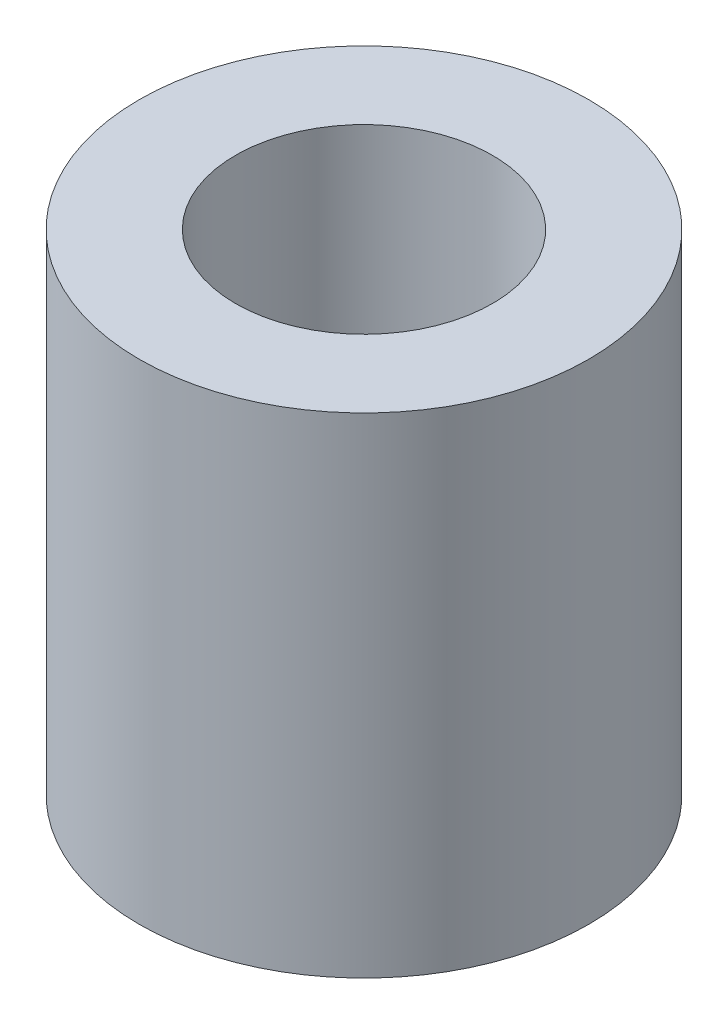
ISO-10303-21;
HEADER;
FILE_DESCRIPTION(('STEP AP214'),'2;1');
FILE_NAME('part.step','',(''),(''),'','','');
FILE_SCHEMA(('AUTOMOTIVE_DESIGN { 1 0 10303 214 1 1 1 1 }'));
ENDSEC;
DATA;
#1=APPLICATION_CONTEXT('core data for automotive mechanical design processes');
#2=APPLICATION_PROTOCOL_DEFINITION('international standard','automotive_design',2000,#1);
#3=PRODUCT_CONTEXT('',#1,'mechanical');
#4=PRODUCT('Part','Part','',(#3));
#5=PRODUCT_RELATED_PRODUCT_CATEGORY('part','',(#4));
#6=PRODUCT_DEFINITION_FORMATION('','',#4);
#7=PRODUCT_DEFINITION_CONTEXT('part definition',#1,'design');
#8=PRODUCT_DEFINITION('design','',#6,#7);
#9=PRODUCT_DEFINITION_SHAPE('','',#8);
#10=(LENGTH_UNIT() NAMED_UNIT(*) SI_UNIT(.MILLI.,.METRE.));
#11=(NAMED_UNIT(*) PLANE_ANGLE_UNIT() SI_UNIT($,.RADIAN.));
#12=(NAMED_UNIT(*) SI_UNIT($,.STERADIAN.) SOLID_ANGLE_UNIT());
#13=UNCERTAINTY_MEASURE_WITH_UNIT(LENGTH_MEASURE(1.E-05),#10,'distance_accuracy_value','');
#14=(GEOMETRIC_REPRESENTATION_CONTEXT(3) GLOBAL_UNCERTAINTY_ASSIGNED_CONTEXT((#13)) GLOBAL_UNIT_ASSIGNED_CONTEXT((#10,
#11,#12)) REPRESENTATION_CONTEXT('',''));
#15=CARTESIAN_POINT('',(0.,0.,0.));
#16=DIRECTION('',(0.,0.,1.));
#17=DIRECTION('',(1.,0.,0.));
#18=AXIS2_PLACEMENT_3D('',#15,#16,#17);
#19=CARTESIAN_POINT('',(0.,-7.62,0.));
#20=DIRECTION('',(0.,1.,0.));
#21=DIRECTION('',(0.,0.,1.));
#22=AXIS2_PLACEMENT_3D('',#19,#20,#21);
#23=CYLINDRICAL_SURFACE('',#22,3.5);
#24=CARTESIAN_POINT('',(0.,-7.62,0.));
#25=DIRECTION('',(0.,1.,0.));
#26=DIRECTION('',(0.,0.,1.));
#27=AXIS2_PLACEMENT_3D('',#24,#25,#26);
#28=CIRCLE('',#27,3.5);
#29=CARTESIAN_POINT('',(0.,-7.62,3.5));
#30=VERTEX_POINT('',#29);
#31=EDGE_CURVE('E10',#30,#30,#28,.T.);
#32=CARTESIAN_POINT('',(0.,0.,0.));
#33=DIRECTION('',(0.,1.,0.));
#34=DIRECTION('',(0.,0.,1.));
#35=AXIS2_PLACEMENT_3D('',#32,#33,#34);
#36=CIRCLE('',#35,3.5);
#37=CARTESIAN_POINT('',(0.,0.,3.5));
#38=VERTEX_POINT('',#37);
#39=EDGE_CURVE('E37',#38,#38,#36,.T.);
#40=CARTESIAN_POINT('',(0.,-7.62,3.5));
#41=CARTESIAN_POINT('',(0.,-7.540625,3.5));
#42=CARTESIAN_POINT('',(0.,-7.46125,3.5));
#43=CARTESIAN_POINT('',(0.,-7.3025,3.5));
#44=CARTESIAN_POINT('',(0.,-7.223125,3.5));
#45=CARTESIAN_POINT('',(0.,-7.064375,3.5));
#46=CARTESIAN_POINT('',(0.,-6.985,3.5));
#47=CARTESIAN_POINT('',(0.,-6.82625,3.5));
#48=CARTESIAN_POINT('',(0.,-6.746875,3.5));
#49=CARTESIAN_POINT('',(0.,-6.588125,3.5));
#50=CARTESIAN_POINT('',(0.,-6.50875,3.5));
#51=CARTESIAN_POINT('',(0.,-6.35,3.5));
#52=CARTESIAN_POINT('',(0.,-6.270625,3.5));
#53=CARTESIAN_POINT('',(0.,-6.111875,3.5));
#54=CARTESIAN_POINT('',(0.,-6.0325,3.5));
#55=CARTESIAN_POINT('',(0.,-5.87375,3.5));
#56=CARTESIAN_POINT('',(0.,-5.794375,3.5));
#57=CARTESIAN_POINT('',(0.,-5.635625,3.5));
#58=CARTESIAN_POINT('',(0.,-5.55625,3.5));
#59=CARTESIAN_POINT('',(0.,-5.3975,3.5));
#60=CARTESIAN_POINT('',(0.,-5.318125,3.5));
#61=CARTESIAN_POINT('',(0.,-5.159375,3.5));
#62=CARTESIAN_POINT('',(0.,-5.08,3.5));
#63=CARTESIAN_POINT('',(0.,-4.92125,3.5));
#64=CARTESIAN_POINT('',(0.,-4.841875,3.5));
#65=CARTESIAN_POINT('',(0.,-4.683125,3.5));
#66=CARTESIAN_POINT('',(0.,-4.60375,3.5));
#67=CARTESIAN_POINT('',(0.,-4.445,3.5));
#68=CARTESIAN_POINT('',(0.,-4.365625,3.5));
#69=CARTESIAN_POINT('',(0.,-4.206875,3.5));
#70=CARTESIAN_POINT('',(0.,-4.1275,3.5));
#71=CARTESIAN_POINT('',(0.,-3.96875,3.5));
#72=CARTESIAN_POINT('',(0.,-3.889375,3.5));
#73=CARTESIAN_POINT('',(0.,-3.730625,3.5));
#74=CARTESIAN_POINT('',(0.,-3.65125,3.5));
#75=CARTESIAN_POINT('',(0.,-3.4925,3.5));
#76=CARTESIAN_POINT('',(0.,-3.413125,3.5));
#77=CARTESIAN_POINT('',(0.,-3.254375,3.5));
#78=CARTESIAN_POINT('',(0.,-3.175,3.5));
#79=CARTESIAN_POINT('',(0.,-3.01625,3.5));
#80=CARTESIAN_POINT('',(0.,-2.936875,3.5));
#81=CARTESIAN_POINT('',(0.,-2.778125,3.5));
#82=CARTESIAN_POINT('',(0.,-2.69875,3.5));
#83=CARTESIAN_POINT('',(0.,-2.54,3.5));
#84=CARTESIAN_POINT('',(0.,-2.460625,3.5));
#85=CARTESIAN_POINT('',(0.,-2.301875,3.5));
#86=CARTESIAN_POINT('',(0.,-2.2225,3.5));
#87=CARTESIAN_POINT('',(0.,-2.06375,3.5));
#88=CARTESIAN_POINT('',(0.,-1.984375,3.5));
#89=CARTESIAN_POINT('',(0.,-1.825625,3.5));
#90=CARTESIAN_POINT('',(0.,-1.74625,3.5));
#91=CARTESIAN_POINT('',(0.,-1.5875,3.5));
#92=CARTESIAN_POINT('',(0.,-1.508125,3.5));
#93=CARTESIAN_POINT('',(0.,-1.349375,3.5));
#94=CARTESIAN_POINT('',(0.,-1.27,3.5));
#95=CARTESIAN_POINT('',(0.,-1.11125,3.5));
#96=CARTESIAN_POINT('',(0.,-1.031875,3.5));
#97=CARTESIAN_POINT('',(0.,-0.873125,3.5));
#98=CARTESIAN_POINT('',(0.,-0.79375,3.5));
#99=CARTESIAN_POINT('',(0.,-0.635,3.5));
#100=CARTESIAN_POINT('',(0.,-0.555625,3.5));
#101=CARTESIAN_POINT('',(0.,-0.396875,3.5));
#102=CARTESIAN_POINT('',(0.,-0.3175,3.5));
#103=CARTESIAN_POINT('',(0.,-0.15875,3.5));
#104=CARTESIAN_POINT('',(0.,-0.0793749999999999,3.5));
#105=CARTESIAN_POINT('',(0.,0.,3.5));
#106=B_SPLINE_CURVE_WITH_KNOTS('',3,(#40,#41,#42,#43,#44,#45,#46,#47,#48,#49,#50,#51,#52,#53,
#54,#55,#56,#57,#58,#59,#60,#61,#62,#63,#64,#65,#66,#67,#68,#69,#70,#71,#72,#73,#74,#75,#76,#77,
#78,#79,#80,#81,#82,#83,#84,#85,#86,#87,#88,#89,#90,#91,#92,#93,#94,#95,#96,#97,#98,#99,#100,
#101,#102,#103,#104,#105),.UNSPECIFIED.,.F.,.F.,(4,2,2,2,2,2,2,2,2,2,2,2,2,2,2,2,2,2,2,2,2,2,2,
2,2,2,2,2,2,2,2,2,4),(0.,0.238125,0.476249999999999,0.714375,0.952499999999999,1.190625,1.42875,
1.666875,1.905,2.143125,2.38125,2.619375,2.8575,3.095625,3.33375,3.571875,3.81,4.048125,4.28625,
4.524375,4.7625,5.000625,5.23875,5.476875,5.715,5.953125,6.19125,6.429375,6.6675,6.905625,
7.14375,7.381875,7.62),.UNSPECIFIED.);
#107=EDGE_CURVE('BSEAM34',#30,#38,#106,.T.);
#108=ORIENTED_EDGE('',*,*,#31,.T.);
#109=ORIENTED_EDGE('',*,*,#39,.F.);
#110=ORIENTED_EDGE('',*,*,#107,.T.);
#111=ORIENTED_EDGE('',*,*,#107,.F.);
#112=EDGE_LOOP('',(#108,#110,#109,#111));
#113=FACE_BOUND('',#112,.T.);
#114=ADVANCED_FACE('F34',(#113),#23,.T.);
#115=CARTESIAN_POINT('',(0.,-7.62,0.));
#116=DIRECTION('',(0.,1.,0.));
#117=DIRECTION('',(0.,0.,1.));
#118=AXIS2_PLACEMENT_3D('',#115,#116,#117);
#119=PLANE('',#118);
#120=CARTESIAN_POINT('',(0.,-7.62,0.));
#121=DIRECTION('',(0.,1.,0.));
#122=DIRECTION('',(0.,0.,1.));
#123=AXIS2_PLACEMENT_3D('',#120,#121,#122);
#124=CIRCLE('',#123,1.999996);
#125=CARTESIAN_POINT('',(0.,-7.62,1.999996));
#126=VERTEX_POINT('',#125);
#127=EDGE_CURVE('E44',#126,#126,#124,.T.);
#128=ORIENTED_EDGE('',*,*,#127,.T.);
#129=EDGE_LOOP('',(#128));
#130=FACE_BOUND('',#129,.T.);
#131=ORIENTED_EDGE('',*,*,#31,.F.);
#132=EDGE_LOOP('',(#131));
#133=FACE_BOUND('',#132,.T.);
#134=ADVANCED_FACE('F52',(#130,#133),#119,.F.);
#135=CARTESIAN_POINT('',(0.,0.,0.));
#136=DIRECTION('',(0.,1.,0.));
#137=DIRECTION('',(0.,0.,1.));
#138=AXIS2_PLACEMENT_3D('',#135,#136,#137);
#139=PLANE('',#138);
#140=CARTESIAN_POINT('',(0.,0.,0.));
#141=DIRECTION('',(0.,1.,0.));
#142=DIRECTION('',(0.,0.,1.));
#143=AXIS2_PLACEMENT_3D('',#140,#141,#142);
#144=CIRCLE('',#143,1.999996);
#145=CARTESIAN_POINT('',(0.,0.,1.999996));
#146=VERTEX_POINT('',#145);
#147=EDGE_CURVE('E46',#146,#146,#144,.T.);
#148=ORIENTED_EDGE('',*,*,#147,.F.);
#149=EDGE_LOOP('',(#148));
#150=FACE_BOUND('',#149,.T.);
#151=ORIENTED_EDGE('',*,*,#39,.T.);
#152=EDGE_LOOP('',(#151));
#153=FACE_BOUND('',#152,.T.);
#154=ADVANCED_FACE('F58',(#150,#153),#139,.T.);
#155=CARTESIAN_POINT('',(0.,-7.62,0.));
#156=DIRECTION('',(0.,1.,0.));
#157=DIRECTION('',(0.,0.,1.));
#158=AXIS2_PLACEMENT_3D('',#155,#156,#157);
#159=CYLINDRICAL_SURFACE('',#158,1.999996);
#160=CARTESIAN_POINT('',(0.,-7.62,1.999996));
#161=CARTESIAN_POINT('',(0.,-7.540625,1.999996));
#162=CARTESIAN_POINT('',(0.,-7.46125,1.999996));
#163=CARTESIAN_POINT('',(0.,-7.3025,1.999996));
#164=CARTESIAN_POINT('',(0.,-7.223125,1.999996));
#165=CARTESIAN_POINT('',(0.,-7.064375,1.999996));
#166=CARTESIAN_POINT('',(0.,-6.985,1.999996));
#167=CARTESIAN_POINT('',(0.,-6.82625,1.999996));
#168=CARTESIAN_POINT('',(0.,-6.746875,1.999996));
#169=CARTESIAN_POINT('',(0.,-6.588125,1.999996));
#170=CARTESIAN_POINT('',(0.,-6.50875,1.999996));
#171=CARTESIAN_POINT('',(0.,-6.35,1.999996));
#172=CARTESIAN_POINT('',(0.,-6.270625,1.999996));
#173=CARTESIAN_POINT('',(0.,-6.111875,1.999996));
#174=CARTESIAN_POINT('',(0.,-6.0325,1.999996));
#175=CARTESIAN_POINT('',(0.,-5.87375,1.999996));
#176=CARTESIAN_POINT('',(0.,-5.794375,1.999996));
#177=CARTESIAN_POINT('',(0.,-5.635625,1.999996));
#178=CARTESIAN_POINT('',(0.,-5.55625,1.999996));
#179=CARTESIAN_POINT('',(0.,-5.3975,1.999996));
#180=CARTESIAN_POINT('',(0.,-5.318125,1.999996));
#181=CARTESIAN_POINT('',(0.,-5.159375,1.999996));
#182=CARTESIAN_POINT('',(0.,-5.08,1.999996));
#183=CARTESIAN_POINT('',(0.,-4.92125,1.999996));
#184=CARTESIAN_POINT('',(0.,-4.841875,1.999996));
#185=CARTESIAN_POINT('',(0.,-4.683125,1.999996));
#186=CARTESIAN_POINT('',(0.,-4.60375,1.999996));
#187=CARTESIAN_POINT('',(0.,-4.445,1.999996));
#188=CARTESIAN_POINT('',(0.,-4.365625,1.999996));
#189=CARTESIAN_POINT('',(0.,-4.206875,1.999996));
#190=CARTESIAN_POINT('',(0.,-4.1275,1.999996));
#191=CARTESIAN_POINT('',(0.,-3.96875,1.999996));
#192=CARTESIAN_POINT('',(0.,-3.889375,1.999996));
#193=CARTESIAN_POINT('',(0.,-3.730625,1.999996));
#194=CARTESIAN_POINT('',(0.,-3.65125,1.999996));
#195=CARTESIAN_POINT('',(0.,-3.4925,1.999996));
#196=CARTESIAN_POINT('',(0.,-3.413125,1.999996));
#197=CARTESIAN_POINT('',(0.,-3.254375,1.999996));
#198=CARTESIAN_POINT('',(0.,-3.175,1.999996));
#199=CARTESIAN_POINT('',(0.,-3.01625,1.999996));
#200=CARTESIAN_POINT('',(0.,-2.936875,1.999996));
#201=CARTESIAN_POINT('',(0.,-2.778125,1.999996));
#202=CARTESIAN_POINT('',(0.,-2.69875,1.999996));
#203=CARTESIAN_POINT('',(0.,-2.54,1.999996));
#204=CARTESIAN_POINT('',(0.,-2.460625,1.999996));
#205=CARTESIAN_POINT('',(0.,-2.301875,1.999996));
#206=CARTESIAN_POINT('',(0.,-2.2225,1.999996));
#207=CARTESIAN_POINT('',(0.,-2.06375,1.999996));
#208=CARTESIAN_POINT('',(0.,-1.984375,1.999996));
#209=CARTESIAN_POINT('',(0.,-1.825625,1.999996));
#210=CARTESIAN_POINT('',(0.,-1.74625,1.999996));
#211=CARTESIAN_POINT('',(0.,-1.5875,1.999996));
#212=CARTESIAN_POINT('',(0.,-1.508125,1.999996));
#213=CARTESIAN_POINT('',(0.,-1.349375,1.999996));
#214=CARTESIAN_POINT('',(0.,-1.27,1.999996));
#215=CARTESIAN_POINT('',(0.,-1.11125,1.999996));
#216=CARTESIAN_POINT('',(0.,-1.031875,1.999996));
#217=CARTESIAN_POINT('',(0.,-0.873125,1.999996));
#218=CARTESIAN_POINT('',(0.,-0.79375,1.999996));
#219=CARTESIAN_POINT('',(0.,-0.635,1.999996));
#220=CARTESIAN_POINT('',(0.,-0.555625,1.999996));
#221=CARTESIAN_POINT('',(0.,-0.396875,1.999996));
#222=CARTESIAN_POINT('',(0.,-0.3175,1.999996));
#223=CARTESIAN_POINT('',(0.,-0.15875,1.999996));
#224=CARTESIAN_POINT('',(0.,-0.0793749999999999,1.999996));
#225=CARTESIAN_POINT('',(0.,0.,1.999996));
#226=B_SPLINE_CURVE_WITH_KNOTS('',3,(#160,#161,#162,#163,#164,#165,#166,#167,#168,#169,#170,
#171,#172,#173,#174,#175,#176,#177,#178,#179,#180,#181,#182,#183,#184,#185,#186,#187,#188,#189,
#190,#191,#192,#193,#194,#195,#196,#197,#198,#199,#200,#201,#202,#203,#204,#205,#206,#207,#208,
#209,#210,#211,#212,#213,#214,#215,#216,#217,#218,#219,#220,#221,#222,#223,#224,#225),
.UNSPECIFIED.,.F.,.F.,(4,2,2,2,2,2,2,2,2,2,2,2,2,2,2,2,2,2,2,2,2,2,2,2,2,2,2,2,2,2,2,2,4),(0.,
0.238125,0.476249999999999,0.714375,0.952499999999999,1.190625,1.42875,1.666875,1.905,2.143125,
2.38125,2.619375,2.8575,3.095625,3.33375,3.571875,3.81,4.048125,4.28625,4.524375,4.7625,
5.000625,5.23875,5.476875,5.715,5.953125,6.19125,6.429375,6.6675,6.905625,7.14375,7.381875,
7.62),.UNSPECIFIED.);
#227=EDGE_CURVE('BSEAM55',#126,#146,#226,.T.);
#228=ORIENTED_EDGE('',*,*,#127,.F.);
#229=ORIENTED_EDGE('',*,*,#147,.T.);
#230=ORIENTED_EDGE('',*,*,#227,.T.);
#231=ORIENTED_EDGE('',*,*,#227,.F.);
#232=EDGE_LOOP('',(#228,#230,#229,#231));
#233=FACE_BOUND('',#232,.T.);
#234=ADVANCED_FACE('F55',(#233),#159,.F.);
#235=CLOSED_SHELL('',(#114,#134,#154,#234));
#236=MANIFOLD_SOLID_BREP('B2',#235);
#237=ADVANCED_BREP_SHAPE_REPRESENTATION('',(#18,#236),#14);
#238=SHAPE_DEFINITION_REPRESENTATION(#9,#237);
ENDSEC;
END-ISO-10303-21;
